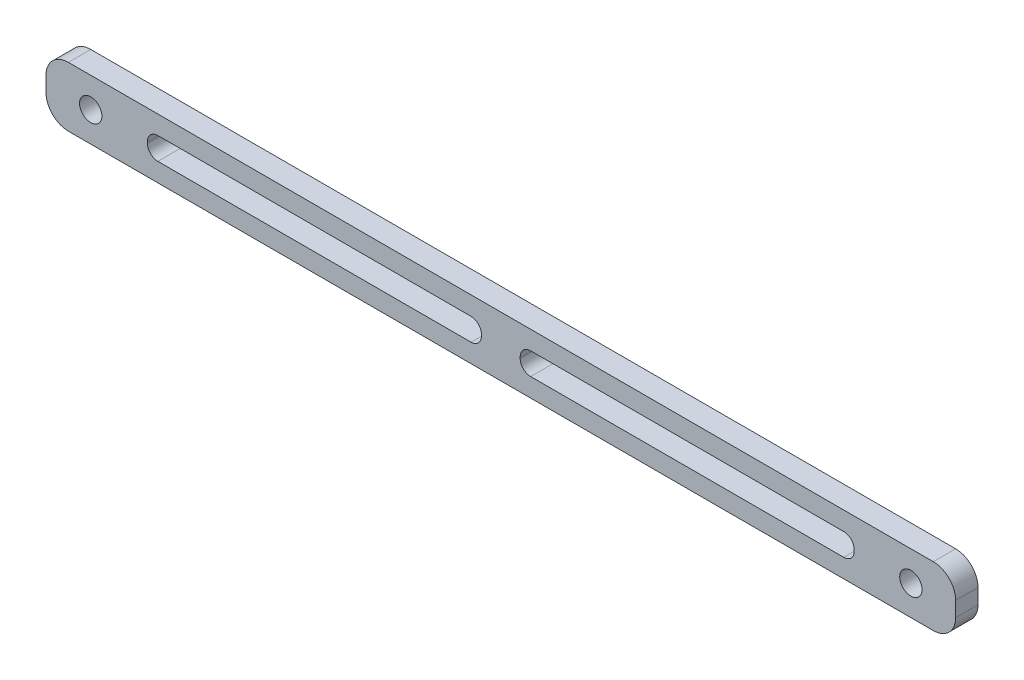
ISO-10303-21;
HEADER;
FILE_DESCRIPTION(('STEP AP214'),'2;1');
FILE_NAME('part.step','',(''),(''),'','','');
FILE_SCHEMA(('AUTOMOTIVE_DESIGN { 1 0 10303 214 1 1 1 1 }'));
ENDSEC;
DATA;
#1=APPLICATION_CONTEXT('core data for automotive mechanical design processes');
#2=APPLICATION_PROTOCOL_DEFINITION('international standard','automotive_design',2000,#1);
#3=PRODUCT_CONTEXT('',#1,'mechanical');
#4=PRODUCT('Part','Part','',(#3));
#5=PRODUCT_RELATED_PRODUCT_CATEGORY('part','',(#4));
#6=PRODUCT_DEFINITION_FORMATION('','',#4);
#7=PRODUCT_DEFINITION_CONTEXT('part definition',#1,'design');
#8=PRODUCT_DEFINITION('design','',#6,#7);
#9=PRODUCT_DEFINITION_SHAPE('','',#8);
#10=(LENGTH_UNIT() NAMED_UNIT(*) SI_UNIT(.MILLI.,.METRE.));
#11=(NAMED_UNIT(*) PLANE_ANGLE_UNIT() SI_UNIT($,.RADIAN.));
#12=(NAMED_UNIT(*) SI_UNIT($,.STERADIAN.) SOLID_ANGLE_UNIT());
#13=UNCERTAINTY_MEASURE_WITH_UNIT(LENGTH_MEASURE(1.E-05),#10,'distance_accuracy_value','');
#14=(GEOMETRIC_REPRESENTATION_CONTEXT(3) GLOBAL_UNCERTAINTY_ASSIGNED_CONTEXT((#13)) GLOBAL_UNIT_ASSIGNED_CONTEXT((#10,
#11,#12)) REPRESENTATION_CONTEXT('',''));
#15=CARTESIAN_POINT('',(0.,0.,0.));
#16=DIRECTION('',(0.,0.,1.));
#17=DIRECTION('',(1.,0.,0.));
#18=AXIS2_PLACEMENT_3D('',#15,#16,#17);
#19=CARTESIAN_POINT('',(58.,-0.999999999999999,3.));
#20=DIRECTION('',(0.,0.,1.));
#21=DIRECTION('',(1.,0.,0.));
#22=AXIS2_PLACEMENT_3D('',#19,#20,#21);
#23=PLANE('',#22);
#24=CARTESIAN_POINT('',(-55.,0.,3.));
#25=DIRECTION('',(0.,0.,1.));
#26=DIRECTION('',(1.,0.,0.));
#27=AXIS2_PLACEMENT_3D('',#24,#25,#26);
#28=CIRCLE('',#27,1.5);
#29=CARTESIAN_POINT('',(-53.5,0.,3.));
#30=VERTEX_POINT('',#29);
#31=EDGE_CURVE('E328',#30,#30,#28,.T.);
#32=ORIENTED_EDGE('',*,*,#31,.F.);
#33=EDGE_LOOP('',(#32));
#34=FACE_BOUND('',#33,.T.);
#35=CARTESIAN_POINT('',(58.,-0.999999999999999,3.));
#36=DIRECTION('',(0.,0.,1.));
#37=DIRECTION('',(1.,0.,0.));
#38=AXIS2_PLACEMENT_3D('',#35,#36,#37);
#39=CIRCLE('',#38,3.);
#40=CARTESIAN_POINT('',(58.,-4.,3.));
#41=VERTEX_POINT('',#40);
#42=CARTESIAN_POINT('',(61.,-0.999999999999977,3.));
#43=VERTEX_POINT('',#42);
#44=EDGE_CURVE('E334',#41,#43,#39,.T.);
#45=ORIENTED_EDGE('',*,*,#44,.T.);
#46=DIRECTION('',(0.,1.,0.));
#47=VECTOR('',#46,1.);
#48=CARTESIAN_POINT('',(61.,0.99999999999998,3.));
#49=LINE('',#48,#47);
#50=CARTESIAN_POINT('',(61.,0.999999999999981,3.));
#51=VERTEX_POINT('',#50);
#52=EDGE_CURVE('E337',#43,#51,#49,.T.);
#53=ORIENTED_EDGE('',*,*,#52,.T.);
#54=CARTESIAN_POINT('',(58.,1.,3.));
#55=DIRECTION('',(0.,0.,1.));
#56=DIRECTION('',(1.,0.,0.));
#57=AXIS2_PLACEMENT_3D('',#54,#55,#56);
#58=CIRCLE('',#57,3.);
#59=CARTESIAN_POINT('',(58.,4.,3.));
#60=VERTEX_POINT('',#59);
#61=EDGE_CURVE('E340',#51,#60,#58,.T.);
#62=ORIENTED_EDGE('',*,*,#61,.T.);
#63=DIRECTION('',(-1.,0.,0.));
#64=VECTOR('',#63,1.);
#65=CARTESIAN_POINT('',(-58.,4.,3.));
#66=LINE('',#65,#64);
#67=CARTESIAN_POINT('',(-58.,4.,3.));
#68=VERTEX_POINT('',#67);
#69=EDGE_CURVE('E342',#60,#68,#66,.T.);
#70=ORIENTED_EDGE('',*,*,#69,.T.);
#71=CARTESIAN_POINT('',(-58.,1.,3.));
#72=DIRECTION('',(0.,0.,1.));
#73=DIRECTION('',(1.,0.,0.));
#74=AXIS2_PLACEMENT_3D('',#71,#72,#73);
#75=CIRCLE('',#74,3.);
#76=CARTESIAN_POINT('',(-61.,0.99999999999998,3.));
#77=VERTEX_POINT('',#76);
#78=EDGE_CURVE('E344',#68,#77,#75,.T.);
#79=ORIENTED_EDGE('',*,*,#78,.T.);
#80=DIRECTION('',(0.,-1.,0.));
#81=VECTOR('',#80,1.);
#82=CARTESIAN_POINT('',(-61.,0.99999999999998,3.));
#83=LINE('',#82,#81);
#84=CARTESIAN_POINT('',(-61.,-0.999999999999999,3.));
#85=VERTEX_POINT('',#84);
#86=EDGE_CURVE('E346',#77,#85,#83,.T.);
#87=ORIENTED_EDGE('',*,*,#86,.T.);
#88=CARTESIAN_POINT('',(-58.,-0.999999999999999,3.));
#89=DIRECTION('',(0.,0.,1.));
#90=DIRECTION('',(-1.,0.,0.));
#91=AXIS2_PLACEMENT_3D('',#88,#89,#90);
#92=CIRCLE('',#91,3.);
#93=CARTESIAN_POINT('',(-58.,-4.,3.));
#94=VERTEX_POINT('',#93);
#95=EDGE_CURVE('E348',#85,#94,#92,.T.);
#96=ORIENTED_EDGE('',*,*,#95,.T.);
#97=DIRECTION('',(1.,0.,0.));
#98=VECTOR('',#97,1.);
#99=CARTESIAN_POINT('',(-58.,-4.,3.));
#100=LINE('',#99,#98);
#101=EDGE_CURVE('E350',#94,#41,#100,.T.);
#102=ORIENTED_EDGE('',*,*,#101,.T.);
#103=EDGE_LOOP('',(#45,#53,#62,#70,#79,#87,#96,#102));
#104=FACE_BOUND('',#103,.T.);
#105=CARTESIAN_POINT('',(55.,0.,3.));
#106=DIRECTION('',(0.,0.,1.));
#107=DIRECTION('',(1.,0.,0.));
#108=AXIS2_PLACEMENT_3D('',#105,#106,#107);
#109=CIRCLE('',#108,1.5);
#110=CARTESIAN_POINT('',(56.5,0.,3.));
#111=VERTEX_POINT('',#110);
#112=EDGE_CURVE('E322',#111,#111,#109,.T.);
#113=ORIENTED_EDGE('',*,*,#112,.F.);
#114=EDGE_LOOP('',(#113));
#115=FACE_BOUND('',#114,.T.);
#116=DIRECTION('',(0.,1.,0.));
#117=VECTOR('',#116,1.);
#118=CARTESIAN_POINT('',(-2.6,0.0999999999999972,3.));
#119=LINE('',#118,#117);
#120=CARTESIAN_POINT('',(-2.6,-0.100000000000003,3.));
#121=VERTEX_POINT('',#120);
#122=CARTESIAN_POINT('',(-2.6,0.0999999999999972,3.));
#123=VERTEX_POINT('',#122);
#124=EDGE_CURVE('E265',#121,#123,#119,.T.);
#125=ORIENTED_EDGE('',*,*,#124,.F.);
#126=CARTESIAN_POINT('',(-4.,-0.100000000000003,3.));
#127=DIRECTION('',(0.,0.,1.));
#128=DIRECTION('',(-1.,0.,0.));
#129=AXIS2_PLACEMENT_3D('',#126,#127,#128);
#130=CIRCLE('',#129,1.4);
#131=CARTESIAN_POINT('',(-4.,-1.5,3.));
#132=VERTEX_POINT('',#131);
#133=EDGE_CURVE('E263',#132,#121,#130,.T.);
#134=ORIENTED_EDGE('',*,*,#133,.F.);
#135=DIRECTION('',(1.,0.,0.));
#136=VECTOR('',#135,1.);
#137=CARTESIAN_POINT('',(-46.,-1.5,3.));
#138=LINE('',#137,#136);
#139=CARTESIAN_POINT('',(-46.,-1.5,3.));
#140=VERTEX_POINT('',#139);
#141=EDGE_CURVE('E279',#140,#132,#138,.T.);
#142=ORIENTED_EDGE('',*,*,#141,.F.);
#143=CARTESIAN_POINT('',(-46.,-0.100000000000003,3.));
#144=DIRECTION('',(0.,0.,1.));
#145=DIRECTION('',(-1.,0.,0.));
#146=AXIS2_PLACEMENT_3D('',#143,#144,#145);
#147=CIRCLE('',#146,1.4);
#148=CARTESIAN_POINT('',(-47.4,-0.100000000000003,3.));
#149=VERTEX_POINT('',#148);
#150=EDGE_CURVE('E276',#149,#140,#147,.T.);
#151=ORIENTED_EDGE('',*,*,#150,.F.);
#152=DIRECTION('',(0.,-1.,0.));
#153=VECTOR('',#152,1.);
#154=CARTESIAN_POINT('',(-47.4,0.099999999999997,3.));
#155=LINE('',#154,#153);
#156=CARTESIAN_POINT('',(-47.4,0.0999999999999972,3.));
#157=VERTEX_POINT('',#156);
#158=EDGE_CURVE('E274',#157,#149,#155,.T.);
#159=ORIENTED_EDGE('',*,*,#158,.F.);
#160=CARTESIAN_POINT('',(-46.,0.099999999999997,3.));
#161=DIRECTION('',(0.,0.,1.));
#162=DIRECTION('',(1.,0.,0.));
#163=AXIS2_PLACEMENT_3D('',#160,#161,#162);
#164=CIRCLE('',#163,1.39999999999999);
#165=CARTESIAN_POINT('',(-46.,1.5,3.));
#166=VERTEX_POINT('',#165);
#167=EDGE_CURVE('E272',#166,#157,#164,.T.);
#168=ORIENTED_EDGE('',*,*,#167,.F.);
#169=DIRECTION('',(-1.,0.,0.));
#170=VECTOR('',#169,1.);
#171=CARTESIAN_POINT('',(-46.,1.5,3.));
#172=LINE('',#171,#170);
#173=CARTESIAN_POINT('',(-4.,1.5,3.));
#174=VERTEX_POINT('',#173);
#175=EDGE_CURVE('E270',#174,#166,#172,.T.);
#176=ORIENTED_EDGE('',*,*,#175,.F.);
#177=CARTESIAN_POINT('',(-4.,0.099999999999997,3.));
#178=DIRECTION('',(0.,0.,1.));
#179=DIRECTION('',(1.,0.,0.));
#180=AXIS2_PLACEMENT_3D('',#177,#178,#179);
#181=CIRCLE('',#180,1.4);
#182=EDGE_CURVE('E268',#123,#174,#181,.T.);
#183=ORIENTED_EDGE('',*,*,#182,.F.);
#184=EDGE_LOOP('',(#125,#134,#142,#151,#159,#168,#176,#183));
#185=FACE_BOUND('',#184,.T.);
#186=DIRECTION('',(0.,1.,0.));
#187=VECTOR('',#186,1.);
#188=CARTESIAN_POINT('',(47.4,0.0943302489444198,3.));
#189=LINE('',#188,#187);
#190=CARTESIAN_POINT('',(47.4,-0.0943302489444121,3.));
#191=VERTEX_POINT('',#190);
#192=CARTESIAN_POINT('',(47.4,0.0943302489444198,3.));
#193=VERTEX_POINT('',#192);
#194=EDGE_CURVE('E206',#191,#193,#189,.T.);
#195=ORIENTED_EDGE('',*,*,#194,.F.);
#196=CARTESIAN_POINT('',(46.,-0.0943302489444123,3.));
#197=DIRECTION('',(0.,0.,1.));
#198=DIRECTION('',(-1.,0.,0.));
#199=AXIS2_PLACEMENT_3D('',#196,#197,#198);
#200=CIRCLE('',#199,1.4);
#201=CARTESIAN_POINT('',(46.,-1.49433024894441,3.));
#202=VERTEX_POINT('',#201);
#203=EDGE_CURVE('E198',#202,#191,#200,.T.);
#204=ORIENTED_EDGE('',*,*,#203,.F.);
#205=DIRECTION('',(1.,0.,0.));
#206=VECTOR('',#205,1.);
#207=CARTESIAN_POINT('',(4.00000000000001,-1.49433024894441,3.));
#208=LINE('',#207,#206);
#209=CARTESIAN_POINT('',(4.00000000000001,-1.49433024894441,3.));
#210=VERTEX_POINT('',#209);
#211=EDGE_CURVE('E231',#210,#202,#208,.T.);
#212=ORIENTED_EDGE('',*,*,#211,.F.);
#213=CARTESIAN_POINT('',(4.00000000000001,-0.0943302489444123,3.));
#214=DIRECTION('',(0.,0.,1.));
#215=DIRECTION('',(-1.,0.,0.));
#216=AXIS2_PLACEMENT_3D('',#213,#214,#215);
#217=CIRCLE('',#216,1.4);
#218=CARTESIAN_POINT('',(2.60000000000001,-0.0943302489444125,3.));
#219=VERTEX_POINT('',#218);
#220=EDGE_CURVE('E229',#219,#210,#217,.T.);
#221=ORIENTED_EDGE('',*,*,#220,.F.);
#222=DIRECTION('',(0.,-1.,0.));
#223=VECTOR('',#222,1.);
#224=CARTESIAN_POINT('',(2.60000000000001,0.0943302489444195,3.));
#225=LINE('',#224,#223);
#226=CARTESIAN_POINT('',(2.60000000000001,0.0943302489444198,3.));
#227=VERTEX_POINT('',#226);
#228=EDGE_CURVE('E227',#227,#219,#225,.T.);
#229=ORIENTED_EDGE('',*,*,#228,.F.);
#230=CARTESIAN_POINT('',(4.00000000000001,0.0943302489444197,3.));
#231=DIRECTION('',(0.,0.,1.));
#232=DIRECTION('',(1.,0.,0.));
#233=AXIS2_PLACEMENT_3D('',#230,#231,#232);
#234=CIRCLE('',#233,1.4);
#235=CARTESIAN_POINT('',(4.00000000000001,1.49433024894442,3.));
#236=VERTEX_POINT('',#235);
#237=EDGE_CURVE('E225',#236,#227,#234,.T.);
#238=ORIENTED_EDGE('',*,*,#237,.F.);
#239=DIRECTION('',(-1.,0.,0.));
#240=VECTOR('',#239,1.);
#241=CARTESIAN_POINT('',(4.00000000000001,1.49433024894442,3.));
#242=LINE('',#241,#240);
#243=CARTESIAN_POINT('',(46.,1.49433024894442,3.));
#244=VERTEX_POINT('',#243);
#245=EDGE_CURVE('E221',#244,#236,#242,.T.);
#246=ORIENTED_EDGE('',*,*,#245,.F.);
#247=CARTESIAN_POINT('',(46.,0.0943302489444197,3.));
#248=DIRECTION('',(0.,0.,1.));
#249=DIRECTION('',(1.,0.,0.));
#250=AXIS2_PLACEMENT_3D('',#247,#248,#249);
#251=CIRCLE('',#250,1.4);
#252=EDGE_CURVE('E219',#193,#244,#251,.T.);
#253=ORIENTED_EDGE('',*,*,#252,.F.);
#254=EDGE_LOOP('',(#195,#204,#212,#221,#229,#238,#246,#253));
#255=FACE_BOUND('',#254,.T.);
#256=ADVANCED_FACE('F37',(#34,#104,#115,#185,#255),#23,.T.);
#257=CARTESIAN_POINT('',(58.,-0.999999999999999,0.));
#258=DIRECTION('',(0.,0.,1.));
#259=DIRECTION('',(1.,0.,0.));
#260=AXIS2_PLACEMENT_3D('',#257,#258,#259);
#261=PLANE('',#260);
#262=CARTESIAN_POINT('',(-4.,-0.100000000000003,0.));
#263=DIRECTION('',(0.,0.,1.));
#264=DIRECTION('',(-1.,0.,0.));
#265=AXIS2_PLACEMENT_3D('',#262,#263,#264);
#266=CIRCLE('',#265,1.4);
#267=CARTESIAN_POINT('',(-4.,-1.5,0.));
#268=VERTEX_POINT('',#267);
#269=CARTESIAN_POINT('',(-2.6,-0.100000000000003,0.));
#270=VERTEX_POINT('',#269);
#271=EDGE_CURVE('E214',#268,#270,#266,.T.);
#272=ORIENTED_EDGE('',*,*,#271,.T.);
#273=DIRECTION('',(0.,1.,0.));
#274=VECTOR('',#273,1.);
#275=CARTESIAN_POINT('',(-2.6,0.0999999999999972,0.));
#276=LINE('',#275,#274);
#277=CARTESIAN_POINT('',(-2.6,0.0999999999999972,0.));
#278=VERTEX_POINT('',#277);
#279=EDGE_CURVE('E284',#270,#278,#276,.T.);
#280=ORIENTED_EDGE('',*,*,#279,.T.);
#281=CARTESIAN_POINT('',(-4.,0.099999999999997,0.));
#282=DIRECTION('',(0.,0.,1.));
#283=DIRECTION('',(1.,0.,0.));
#284=AXIS2_PLACEMENT_3D('',#281,#282,#283);
#285=CIRCLE('',#284,1.4);
#286=CARTESIAN_POINT('',(-4.,1.5,0.));
#287=VERTEX_POINT('',#286);
#288=EDGE_CURVE('E287',#278,#287,#285,.T.);
#289=ORIENTED_EDGE('',*,*,#288,.T.);
#290=DIRECTION('',(-1.,0.,0.));
#291=VECTOR('',#290,1.);
#292=CARTESIAN_POINT('',(-46.,1.5,0.));
#293=LINE('',#292,#291);
#294=CARTESIAN_POINT('',(-46.,1.5,0.));
#295=VERTEX_POINT('',#294);
#296=EDGE_CURVE('E290',#287,#295,#293,.T.);
#297=ORIENTED_EDGE('',*,*,#296,.T.);
#298=CARTESIAN_POINT('',(-46.,0.099999999999997,0.));
#299=DIRECTION('',(0.,0.,1.));
#300=DIRECTION('',(1.,0.,0.));
#301=AXIS2_PLACEMENT_3D('',#298,#299,#300);
#302=CIRCLE('',#301,1.39999999999999);
#303=CARTESIAN_POINT('',(-47.4,0.0999999999999972,0.));
#304=VERTEX_POINT('',#303);
#305=EDGE_CURVE('E293',#295,#304,#302,.T.);
#306=ORIENTED_EDGE('',*,*,#305,.T.);
#307=DIRECTION('',(0.,-1.,0.));
#308=VECTOR('',#307,1.);
#309=CARTESIAN_POINT('',(-47.4,0.099999999999997,0.));
#310=LINE('',#309,#308);
#311=CARTESIAN_POINT('',(-47.4,-0.100000000000003,0.));
#312=VERTEX_POINT('',#311);
#313=EDGE_CURVE('E296',#304,#312,#310,.T.);
#314=ORIENTED_EDGE('',*,*,#313,.T.);
#315=CARTESIAN_POINT('',(-46.,-0.100000000000003,0.));
#316=DIRECTION('',(0.,0.,1.));
#317=DIRECTION('',(-1.,0.,0.));
#318=AXIS2_PLACEMENT_3D('',#315,#316,#317);
#319=CIRCLE('',#318,1.4);
#320=CARTESIAN_POINT('',(-46.,-1.5,0.));
#321=VERTEX_POINT('',#320);
#322=EDGE_CURVE('E299',#312,#321,#319,.T.);
#323=ORIENTED_EDGE('',*,*,#322,.T.);
#324=DIRECTION('',(1.,0.,0.));
#325=VECTOR('',#324,1.);
#326=CARTESIAN_POINT('',(-46.,-1.5,0.));
#327=LINE('',#326,#325);
#328=EDGE_CURVE('E266',#321,#268,#327,.T.);
#329=ORIENTED_EDGE('',*,*,#328,.T.);
#330=EDGE_LOOP('',(#272,#280,#289,#297,#306,#314,#323,#329));
#331=FACE_BOUND('',#330,.T.);
#332=CARTESIAN_POINT('',(58.,-0.999999999999999,0.));
#333=DIRECTION('',(0.,0.,1.));
#334=DIRECTION('',(1.,0.,0.));
#335=AXIS2_PLACEMENT_3D('',#332,#333,#334);
#336=CIRCLE('',#335,3.);
#337=CARTESIAN_POINT('',(58.,-4.,0.));
#338=VERTEX_POINT('',#337);
#339=CARTESIAN_POINT('',(61.,-0.999999999999977,0.));
#340=VERTEX_POINT('',#339);
#341=EDGE_CURVE('E331',#338,#340,#336,.T.);
#342=ORIENTED_EDGE('',*,*,#341,.F.);
#343=DIRECTION('',(1.,0.,0.));
#344=VECTOR('',#343,1.);
#345=CARTESIAN_POINT('',(-58.,-4.,0.));
#346=LINE('',#345,#344);
#347=CARTESIAN_POINT('',(-58.,-4.,0.));
#348=VERTEX_POINT('',#347);
#349=EDGE_CURVE('E338',#348,#338,#346,.T.);
#350=ORIENTED_EDGE('',*,*,#349,.F.);
#351=CARTESIAN_POINT('',(-58.,-0.999999999999999,0.));
#352=DIRECTION('',(0.,0.,1.));
#353=DIRECTION('',(-1.,0.,0.));
#354=AXIS2_PLACEMENT_3D('',#351,#352,#353);
#355=CIRCLE('',#354,3.);
#356=CARTESIAN_POINT('',(-61.,-0.999999999999999,0.));
#357=VERTEX_POINT('',#356);
#358=EDGE_CURVE('E365',#357,#348,#355,.T.);
#359=ORIENTED_EDGE('',*,*,#358,.F.);
#360=DIRECTION('',(0.,-1.,0.));
#361=VECTOR('',#360,1.);
#362=CARTESIAN_POINT('',(-61.,0.99999999999998,0.));
#363=LINE('',#362,#361);
#364=CARTESIAN_POINT('',(-61.,0.99999999999998,0.));
#365=VERTEX_POINT('',#364);
#366=EDGE_CURVE('E363',#365,#357,#363,.T.);
#367=ORIENTED_EDGE('',*,*,#366,.F.);
#368=CARTESIAN_POINT('',(-58.,1.,0.));
#369=DIRECTION('',(0.,0.,1.));
#370=DIRECTION('',(1.,0.,0.));
#371=AXIS2_PLACEMENT_3D('',#368,#369,#370);
#372=CIRCLE('',#371,3.);
#373=CARTESIAN_POINT('',(-58.,4.,0.));
#374=VERTEX_POINT('',#373);
#375=EDGE_CURVE('E361',#374,#365,#372,.T.);
#376=ORIENTED_EDGE('',*,*,#375,.F.);
#377=DIRECTION('',(-1.,0.,0.));
#378=VECTOR('',#377,1.);
#379=CARTESIAN_POINT('',(-58.,4.,0.));
#380=LINE('',#379,#378);
#381=CARTESIAN_POINT('',(58.,4.,0.));
#382=VERTEX_POINT('',#381);
#383=EDGE_CURVE('E359',#382,#374,#380,.T.);
#384=ORIENTED_EDGE('',*,*,#383,.F.);
#385=CARTESIAN_POINT('',(58.,1.,0.));
#386=DIRECTION('',(0.,0.,1.));
#387=DIRECTION('',(1.,0.,0.));
#388=AXIS2_PLACEMENT_3D('',#385,#386,#387);
#389=CIRCLE('',#388,3.);
#390=CARTESIAN_POINT('',(61.,0.999999999999981,0.));
#391=VERTEX_POINT('',#390);
#392=EDGE_CURVE('E357',#391,#382,#389,.T.);
#393=ORIENTED_EDGE('',*,*,#392,.F.);
#394=DIRECTION('',(0.,1.,0.));
#395=VECTOR('',#394,1.);
#396=CARTESIAN_POINT('',(61.,0.99999999999998,0.));
#397=LINE('',#396,#395);
#398=EDGE_CURVE('E355',#340,#391,#397,.T.);
#399=ORIENTED_EDGE('',*,*,#398,.F.);
#400=EDGE_LOOP('',(#342,#350,#359,#367,#376,#384,#393,#399));
#401=FACE_BOUND('',#400,.T.);
#402=CARTESIAN_POINT('',(-55.,0.,0.));
#403=DIRECTION('',(0.,0.,1.));
#404=DIRECTION('',(1.,0.,0.));
#405=AXIS2_PLACEMENT_3D('',#402,#403,#404);
#406=CIRCLE('',#405,1.5);
#407=CARTESIAN_POINT('',(-53.5,0.,0.));
#408=VERTEX_POINT('',#407);
#409=EDGE_CURVE('E325',#408,#408,#406,.T.);
#410=ORIENTED_EDGE('',*,*,#409,.T.);
#411=EDGE_LOOP('',(#410));
#412=FACE_BOUND('',#411,.T.);
#413=CARTESIAN_POINT('',(55.,0.,0.));
#414=DIRECTION('',(0.,0.,1.));
#415=DIRECTION('',(1.,0.,0.));
#416=AXIS2_PLACEMENT_3D('',#413,#414,#415);
#417=CIRCLE('',#416,1.5);
#418=CARTESIAN_POINT('',(56.5,0.,0.));
#419=VERTEX_POINT('',#418);
#420=EDGE_CURVE('E321',#419,#419,#417,.T.);
#421=ORIENTED_EDGE('',*,*,#420,.T.);
#422=EDGE_LOOP('',(#421));
#423=FACE_BOUND('',#422,.T.);
#424=CARTESIAN_POINT('',(46.,-0.0943302489444123,0.));
#425=DIRECTION('',(0.,0.,1.));
#426=DIRECTION('',(-1.,0.,0.));
#427=AXIS2_PLACEMENT_3D('',#424,#425,#426);
#428=CIRCLE('',#427,1.4);
#429=CARTESIAN_POINT('',(46.,-1.49433024894441,0.));
#430=VERTEX_POINT('',#429);
#431=CARTESIAN_POINT('',(47.4,-0.0943302489444121,0.));
#432=VERTEX_POINT('',#431);
#433=EDGE_CURVE('E60',#430,#432,#428,.T.);
#434=ORIENTED_EDGE('',*,*,#433,.T.);
#435=DIRECTION('',(0.,1.,0.));
#436=VECTOR('',#435,1.);
#437=CARTESIAN_POINT('',(47.4,0.0943302489444198,0.));
#438=LINE('',#437,#436);
#439=CARTESIAN_POINT('',(47.4,0.0943302489444198,0.));
#440=VERTEX_POINT('',#439);
#441=EDGE_CURVE('E213',#432,#440,#438,.T.);
#442=ORIENTED_EDGE('',*,*,#441,.T.);
#443=CARTESIAN_POINT('',(46.,0.0943302489444197,0.));
#444=DIRECTION('',(0.,0.,1.));
#445=DIRECTION('',(1.,0.,0.));
#446=AXIS2_PLACEMENT_3D('',#443,#444,#445);
#447=CIRCLE('',#446,1.4);
#448=CARTESIAN_POINT('',(46.,1.49433024894442,0.));
#449=VERTEX_POINT('',#448);
#450=EDGE_CURVE('E235',#440,#449,#447,.T.);
#451=ORIENTED_EDGE('',*,*,#450,.T.);
#452=DIRECTION('',(-1.,0.,0.));
#453=VECTOR('',#452,1.);
#454=CARTESIAN_POINT('',(4.00000000000001,1.49433024894442,0.));
#455=LINE('',#454,#453);
#456=CARTESIAN_POINT('',(4.00000000000001,1.49433024894442,0.));
#457=VERTEX_POINT('',#456);
#458=EDGE_CURVE('E238',#449,#457,#455,.T.);
#459=ORIENTED_EDGE('',*,*,#458,.T.);
#460=CARTESIAN_POINT('',(4.00000000000001,0.0943302489444197,0.));
#461=DIRECTION('',(0.,0.,1.));
#462=DIRECTION('',(1.,0.,0.));
#463=AXIS2_PLACEMENT_3D('',#460,#461,#462);
#464=CIRCLE('',#463,1.4);
#465=CARTESIAN_POINT('',(2.60000000000001,0.0943302489444198,0.));
#466=VERTEX_POINT('',#465);
#467=EDGE_CURVE('E241',#457,#466,#464,.T.);
#468=ORIENTED_EDGE('',*,*,#467,.T.);
#469=DIRECTION('',(0.,-1.,0.));
#470=VECTOR('',#469,1.);
#471=CARTESIAN_POINT('',(2.60000000000001,0.0943302489444195,0.));
#472=LINE('',#471,#470);
#473=CARTESIAN_POINT('',(2.60000000000001,-0.0943302489444125,0.));
#474=VERTEX_POINT('',#473);
#475=EDGE_CURVE('E244',#466,#474,#472,.T.);
#476=ORIENTED_EDGE('',*,*,#475,.T.);
#477=CARTESIAN_POINT('',(4.00000000000001,-0.0943302489444123,0.));
#478=DIRECTION('',(0.,0.,1.));
#479=DIRECTION('',(-1.,0.,0.));
#480=AXIS2_PLACEMENT_3D('',#477,#478,#479);
#481=CIRCLE('',#480,1.4);
#482=CARTESIAN_POINT('',(4.00000000000001,-1.49433024894441,0.));
#483=VERTEX_POINT('',#482);
#484=EDGE_CURVE('E247',#474,#483,#481,.T.);
#485=ORIENTED_EDGE('',*,*,#484,.T.);
#486=DIRECTION('',(1.,0.,0.));
#487=VECTOR('',#486,1.);
#488=CARTESIAN_POINT('',(4.00000000000001,-1.49433024894441,0.));
#489=LINE('',#488,#487);
#490=EDGE_CURVE('E207',#483,#430,#489,.T.);
#491=ORIENTED_EDGE('',*,*,#490,.T.);
#492=EDGE_LOOP('',(#434,#442,#451,#459,#468,#476,#485,#491));
#493=FACE_BOUND('',#492,.T.);
#494=ADVANCED_FACE('F395',(#331,#401,#412,#423,#493),#261,.F.);
#495=CARTESIAN_POINT('',(58.,-0.999999999999999,3.));
#496=DIRECTION('',(0.,0.,-1.));
#497=DIRECTION('',(-1.,0.,0.));
#498=AXIS2_PLACEMENT_3D('',#495,#496,#497);
#499=CYLINDRICAL_SURFACE('',#498,3.);
#500=ORIENTED_EDGE('',*,*,#341,.T.);
#501=DIRECTION('',(0.,0.,-1.));
#502=VECTOR('',#501,1.);
#503=CARTESIAN_POINT('',(61.,-0.999999999999977,3.));
#504=LINE('',#503,#502);
#505=EDGE_CURVE('E11',#43,#340,#504,.T.);
#506=ORIENTED_EDGE('',*,*,#505,.F.);
#507=ORIENTED_EDGE('',*,*,#44,.F.);
#508=DIRECTION('',(0.,0.,-1.));
#509=VECTOR('',#508,1.);
#510=CARTESIAN_POINT('',(58.,-4.,3.));
#511=LINE('',#510,#509);
#512=EDGE_CURVE('E352',#41,#338,#511,.T.);
#513=ORIENTED_EDGE('',*,*,#512,.T.);
#514=EDGE_LOOP('',(#500,#506,#507,#513));
#515=FACE_BOUND('',#514,.T.);
#516=ADVANCED_FACE('F39',(#515),#499,.T.);
#517=CARTESIAN_POINT('',(61.,0.99999999999998,3.));
#518=DIRECTION('',(-1.,0.,0.));
#519=DIRECTION('',(0.,0.,1.));
#520=AXIS2_PLACEMENT_3D('',#517,#518,#519);
#521=PLANE('',#520);
#522=ORIENTED_EDGE('',*,*,#398,.T.);
#523=DIRECTION('',(0.,0.,-1.));
#524=VECTOR('',#523,1.);
#525=CARTESIAN_POINT('',(61.,0.999999999999981,3.));
#526=LINE('',#525,#524);
#527=EDGE_CURVE('E45',#51,#391,#526,.T.);
#528=ORIENTED_EDGE('',*,*,#527,.F.);
#529=ORIENTED_EDGE('',*,*,#52,.F.);
#530=ORIENTED_EDGE('',*,*,#505,.T.);
#531=EDGE_LOOP('',(#522,#528,#529,#530));
#532=FACE_BOUND('',#531,.T.);
#533=ADVANCED_FACE('F413',(#532),#521,.F.);
#534=CARTESIAN_POINT('',(58.,1.,3.));
#535=DIRECTION('',(0.,0.,-1.));
#536=DIRECTION('',(-1.,0.,0.));
#537=AXIS2_PLACEMENT_3D('',#534,#535,#536);
#538=CYLINDRICAL_SURFACE('',#537,3.);
#539=ORIENTED_EDGE('',*,*,#392,.T.);
#540=DIRECTION('',(0.,0.,-1.));
#541=VECTOR('',#540,1.);
#542=CARTESIAN_POINT('',(58.,4.,3.));
#543=LINE('',#542,#541);
#544=EDGE_CURVE('E382',#60,#382,#543,.T.);
#545=ORIENTED_EDGE('',*,*,#544,.F.);
#546=ORIENTED_EDGE('',*,*,#61,.F.);
#547=ORIENTED_EDGE('',*,*,#527,.T.);
#548=EDGE_LOOP('',(#539,#545,#546,#547));
#549=FACE_BOUND('',#548,.T.);
#550=ADVANCED_FACE('F389',(#549),#538,.T.);
#551=CARTESIAN_POINT('',(-58.,4.,3.));
#552=DIRECTION('',(0.,-1.,0.));
#553=DIRECTION('',(0.,0.,-1.));
#554=AXIS2_PLACEMENT_3D('',#551,#552,#553);
#555=PLANE('',#554);
#556=ORIENTED_EDGE('',*,*,#383,.T.);
#557=DIRECTION('',(0.,0.,-1.));
#558=VECTOR('',#557,1.);
#559=CARTESIAN_POINT('',(-58.,4.,3.));
#560=LINE('',#559,#558);
#561=EDGE_CURVE('E379',#68,#374,#560,.T.);
#562=ORIENTED_EDGE('',*,*,#561,.F.);
#563=ORIENTED_EDGE('',*,*,#69,.F.);
#564=ORIENTED_EDGE('',*,*,#544,.T.);
#565=EDGE_LOOP('',(#556,#562,#563,#564));
#566=FACE_BOUND('',#565,.T.);
#567=ADVANCED_FACE('F401',(#566),#555,.F.);
#568=CARTESIAN_POINT('',(-58.,1.,3.));
#569=DIRECTION('',(0.,0.,-1.));
#570=DIRECTION('',(-1.,0.,0.));
#571=AXIS2_PLACEMENT_3D('',#568,#569,#570);
#572=CYLINDRICAL_SURFACE('',#571,3.);
#573=ORIENTED_EDGE('',*,*,#375,.T.);
#574=DIRECTION('',(0.,0.,-1.));
#575=VECTOR('',#574,1.);
#576=CARTESIAN_POINT('',(-61.,0.99999999999998,3.));
#577=LINE('',#576,#575);
#578=EDGE_CURVE('E376',#77,#365,#577,.T.);
#579=ORIENTED_EDGE('',*,*,#578,.F.);
#580=ORIENTED_EDGE('',*,*,#78,.F.);
#581=ORIENTED_EDGE('',*,*,#561,.T.);
#582=EDGE_LOOP('',(#573,#579,#580,#581));
#583=FACE_BOUND('',#582,.T.);
#584=ADVANCED_FACE('F405',(#583),#572,.T.);
#585=CARTESIAN_POINT('',(-61.,0.99999999999998,3.));
#586=DIRECTION('',(1.,0.,0.));
#587=DIRECTION('',(0.,0.,-1.));
#588=AXIS2_PLACEMENT_3D('',#585,#586,#587);
#589=PLANE('',#588);
#590=ORIENTED_EDGE('',*,*,#366,.T.);
#591=DIRECTION('',(0.,0.,-1.));
#592=VECTOR('',#591,1.);
#593=CARTESIAN_POINT('',(-61.,-0.999999999999999,3.));
#594=LINE('',#593,#592);
#595=EDGE_CURVE('E373',#85,#357,#594,.T.);
#596=ORIENTED_EDGE('',*,*,#595,.F.);
#597=ORIENTED_EDGE('',*,*,#86,.F.);
#598=ORIENTED_EDGE('',*,*,#578,.T.);
#599=EDGE_LOOP('',(#590,#596,#597,#598));
#600=FACE_BOUND('',#599,.T.);
#601=ADVANCED_FACE('F426',(#600),#589,.F.);
#602=CARTESIAN_POINT('',(-58.,-0.999999999999999,3.));
#603=DIRECTION('',(0.,0.,-1.));
#604=DIRECTION('',(-1.,0.,0.));
#605=AXIS2_PLACEMENT_3D('',#602,#603,#604);
#606=CYLINDRICAL_SURFACE('',#605,3.);
#607=ORIENTED_EDGE('',*,*,#358,.T.);
#608=DIRECTION('',(0.,0.,-1.));
#609=VECTOR('',#608,1.);
#610=CARTESIAN_POINT('',(-58.,-4.,3.));
#611=LINE('',#610,#609);
#612=EDGE_CURVE('E370',#94,#348,#611,.T.);
#613=ORIENTED_EDGE('',*,*,#612,.F.);
#614=ORIENTED_EDGE('',*,*,#95,.F.);
#615=ORIENTED_EDGE('',*,*,#595,.T.);
#616=EDGE_LOOP('',(#607,#613,#614,#615));
#617=FACE_BOUND('',#616,.T.);
#618=ADVANCED_FACE('F424',(#617),#606,.T.);
#619=CARTESIAN_POINT('',(-58.,-4.,3.));
#620=DIRECTION('',(0.,1.,0.));
#621=DIRECTION('',(0.,0.,1.));
#622=AXIS2_PLACEMENT_3D('',#619,#620,#621);
#623=PLANE('',#622);
#624=ORIENTED_EDGE('',*,*,#349,.T.);
#625=ORIENTED_EDGE('',*,*,#512,.F.);
#626=ORIENTED_EDGE('',*,*,#101,.F.);
#627=ORIENTED_EDGE('',*,*,#612,.T.);
#628=EDGE_LOOP('',(#624,#625,#626,#627));
#629=FACE_BOUND('',#628,.T.);
#630=ADVANCED_FACE('F419',(#629),#623,.F.);
#631=CARTESIAN_POINT('',(-55.,0.,3.));
#632=DIRECTION('',(0.,0.,-1.));
#633=DIRECTION('',(-1.,0.,0.));
#634=AXIS2_PLACEMENT_3D('',#631,#632,#633);
#635=CYLINDRICAL_SURFACE('',#634,1.5);
#636=ORIENTED_EDGE('',*,*,#31,.T.);
#637=EDGE_LOOP('',(#636));
#638=FACE_BOUND('',#637,.T.);
#639=ORIENTED_EDGE('',*,*,#409,.F.);
#640=EDGE_LOOP('',(#639));
#641=FACE_BOUND('',#640,.T.);
#642=ADVANCED_FACE('F445',(#638,#641),#635,.F.);
#643=CARTESIAN_POINT('',(55.,0.,3.));
#644=DIRECTION('',(0.,0.,-1.));
#645=DIRECTION('',(-1.,0.,0.));
#646=AXIS2_PLACEMENT_3D('',#643,#644,#645);
#647=CYLINDRICAL_SURFACE('',#646,1.5);
#648=ORIENTED_EDGE('',*,*,#112,.T.);
#649=EDGE_LOOP('',(#648));
#650=FACE_BOUND('',#649,.T.);
#651=ORIENTED_EDGE('',*,*,#420,.F.);
#652=EDGE_LOOP('',(#651));
#653=FACE_BOUND('',#652,.T.);
#654=ADVANCED_FACE('F452',(#650,#653),#647,.F.);
#655=CARTESIAN_POINT('',(-4.,-0.100000000000003,3.));
#656=DIRECTION('',(0.,0.,-1.));
#657=DIRECTION('',(-1.,0.,0.));
#658=AXIS2_PLACEMENT_3D('',#655,#656,#657);
#659=CYLINDRICAL_SURFACE('',#658,1.4);
#660=ORIENTED_EDGE('',*,*,#271,.F.);
#661=DIRECTION('',(0.,0.,-1.));
#662=VECTOR('',#661,1.);
#663=CARTESIAN_POINT('',(-4.,-1.5,3.));
#664=LINE('',#663,#662);
#665=EDGE_CURVE('E281',#132,#268,#664,.T.);
#666=ORIENTED_EDGE('',*,*,#665,.F.);
#667=ORIENTED_EDGE('',*,*,#133,.T.);
#668=DIRECTION('',(0.,0.,-1.));
#669=VECTOR('',#668,1.);
#670=CARTESIAN_POINT('',(-2.6,-0.100000000000003,3.));
#671=LINE('',#670,#669);
#672=EDGE_CURVE('E318',#121,#270,#671,.T.);
#673=ORIENTED_EDGE('',*,*,#672,.T.);
#674=EDGE_LOOP('',(#660,#666,#667,#673));
#675=FACE_BOUND('',#674,.T.);
#676=ADVANCED_FACE('F457',(#675),#659,.F.);
#677=CARTESIAN_POINT('',(-2.6,0.0999999999999972,3.));
#678=DIRECTION('',(-1.,0.,0.));
#679=DIRECTION('',(0.,-1.,0.));
#680=AXIS2_PLACEMENT_3D('',#677,#678,#679);
#681=PLANE('',#680);
#682=ORIENTED_EDGE('',*,*,#279,.F.);
#683=ORIENTED_EDGE('',*,*,#672,.F.);
#684=ORIENTED_EDGE('',*,*,#124,.T.);
#685=DIRECTION('',(0.,0.,-1.));
#686=VECTOR('',#685,1.);
#687=CARTESIAN_POINT('',(-2.6,0.0999999999999972,3.));
#688=LINE('',#687,#686);
#689=EDGE_CURVE('E316',#123,#278,#688,.T.);
#690=ORIENTED_EDGE('',*,*,#689,.T.);
#691=EDGE_LOOP('',(#682,#683,#684,#690));
#692=FACE_BOUND('',#691,.T.);
#693=ADVANCED_FACE('F522',(#692),#681,.T.);
#694=CARTESIAN_POINT('',(-4.,0.099999999999997,3.));
#695=DIRECTION('',(0.,0.,-1.));
#696=DIRECTION('',(-1.,0.,0.));
#697=AXIS2_PLACEMENT_3D('',#694,#695,#696);
#698=CYLINDRICAL_SURFACE('',#697,1.4);
#699=ORIENTED_EDGE('',*,*,#288,.F.);
#700=ORIENTED_EDGE('',*,*,#689,.F.);
#701=ORIENTED_EDGE('',*,*,#182,.T.);
#702=DIRECTION('',(0.,0.,-1.));
#703=VECTOR('',#702,1.);
#704=CARTESIAN_POINT('',(-4.,1.5,3.));
#705=LINE('',#704,#703);
#706=EDGE_CURVE('E314',#174,#287,#705,.T.);
#707=ORIENTED_EDGE('',*,*,#706,.T.);
#708=EDGE_LOOP('',(#699,#700,#701,#707));
#709=FACE_BOUND('',#708,.T.);
#710=ADVANCED_FACE('F518',(#709),#698,.F.);
#711=CARTESIAN_POINT('',(-46.,1.5,3.));
#712=DIRECTION('',(0.,-1.,0.));
#713=DIRECTION('',(1.,0.,0.));
#714=AXIS2_PLACEMENT_3D('',#711,#712,#713);
#715=PLANE('',#714);
#716=ORIENTED_EDGE('',*,*,#296,.F.);
#717=ORIENTED_EDGE('',*,*,#706,.F.);
#718=ORIENTED_EDGE('',*,*,#175,.T.);
#719=DIRECTION('',(0.,0.,-1.));
#720=VECTOR('',#719,1.);
#721=CARTESIAN_POINT('',(-46.,1.5,3.));
#722=LINE('',#721,#720);
#723=EDGE_CURVE('E312',#166,#295,#722,.T.);
#724=ORIENTED_EDGE('',*,*,#723,.T.);
#725=EDGE_LOOP('',(#716,#717,#718,#724));
#726=FACE_BOUND('',#725,.T.);
#727=ADVANCED_FACE('F514',(#726),#715,.T.);
#728=CARTESIAN_POINT('',(-46.,0.099999999999997,3.));
#729=DIRECTION('',(0.,0.,-1.));
#730=DIRECTION('',(-1.,0.,0.));
#731=AXIS2_PLACEMENT_3D('',#728,#729,#730);
#732=CYLINDRICAL_SURFACE('',#731,1.39999999999999);
#733=ORIENTED_EDGE('',*,*,#305,.F.);
#734=ORIENTED_EDGE('',*,*,#723,.F.);
#735=ORIENTED_EDGE('',*,*,#167,.T.);
#736=DIRECTION('',(0.,0.,-1.));
#737=VECTOR('',#736,1.);
#738=CARTESIAN_POINT('',(-47.4,0.0999999999999972,3.));
#739=LINE('',#738,#737);
#740=EDGE_CURVE('E310',#157,#304,#739,.T.);
#741=ORIENTED_EDGE('',*,*,#740,.T.);
#742=EDGE_LOOP('',(#733,#734,#735,#741));
#743=FACE_BOUND('',#742,.T.);
#744=ADVANCED_FACE('F510',(#743),#732,.F.);
#745=CARTESIAN_POINT('',(-47.4,0.099999999999997,3.));
#746=DIRECTION('',(1.,0.,0.));
#747=DIRECTION('',(0.,1.,0.));
#748=AXIS2_PLACEMENT_3D('',#745,#746,#747);
#749=PLANE('',#748);
#750=ORIENTED_EDGE('',*,*,#313,.F.);
#751=ORIENTED_EDGE('',*,*,#740,.F.);
#752=ORIENTED_EDGE('',*,*,#158,.T.);
#753=DIRECTION('',(0.,0.,-1.));
#754=VECTOR('',#753,1.);
#755=CARTESIAN_POINT('',(-47.4,-0.100000000000003,3.));
#756=LINE('',#755,#754);
#757=EDGE_CURVE('E308',#149,#312,#756,.T.);
#758=ORIENTED_EDGE('',*,*,#757,.T.);
#759=EDGE_LOOP('',(#750,#751,#752,#758));
#760=FACE_BOUND('',#759,.T.);
#761=ADVANCED_FACE('F506',(#760),#749,.T.);
#762=CARTESIAN_POINT('',(-46.,-0.100000000000003,3.));
#763=DIRECTION('',(0.,0.,-1.));
#764=DIRECTION('',(-1.,0.,0.));
#765=AXIS2_PLACEMENT_3D('',#762,#763,#764);
#766=CYLINDRICAL_SURFACE('',#765,1.4);
#767=ORIENTED_EDGE('',*,*,#322,.F.);
#768=ORIENTED_EDGE('',*,*,#757,.F.);
#769=ORIENTED_EDGE('',*,*,#150,.T.);
#770=DIRECTION('',(0.,0.,-1.));
#771=VECTOR('',#770,1.);
#772=CARTESIAN_POINT('',(-46.,-1.5,3.));
#773=LINE('',#772,#771);
#774=EDGE_CURVE('E306',#140,#321,#773,.T.);
#775=ORIENTED_EDGE('',*,*,#774,.T.);
#776=EDGE_LOOP('',(#767,#768,#769,#775));
#777=FACE_BOUND('',#776,.T.);
#778=ADVANCED_FACE('F502',(#777),#766,.F.);
#779=CARTESIAN_POINT('',(-46.,-1.5,3.));
#780=DIRECTION('',(0.,1.,0.));
#781=DIRECTION('',(0.,0.,1.));
#782=AXIS2_PLACEMENT_3D('',#779,#780,#781);
#783=PLANE('',#782);
#784=ORIENTED_EDGE('',*,*,#328,.F.);
#785=ORIENTED_EDGE('',*,*,#774,.F.);
#786=ORIENTED_EDGE('',*,*,#141,.T.);
#787=ORIENTED_EDGE('',*,*,#665,.T.);
#788=EDGE_LOOP('',(#784,#785,#786,#787));
#789=FACE_BOUND('',#788,.T.);
#790=ADVANCED_FACE('F499',(#789),#783,.T.);
#791=CARTESIAN_POINT('',(46.,-0.0943302489444123,3.));
#792=DIRECTION('',(0.,0.,-1.));
#793=DIRECTION('',(-1.,0.,0.));
#794=AXIS2_PLACEMENT_3D('',#791,#792,#793);
#795=CYLINDRICAL_SURFACE('',#794,1.4);
#796=ORIENTED_EDGE('',*,*,#433,.F.);
#797=DIRECTION('',(0.,0.,-1.));
#798=VECTOR('',#797,1.);
#799=CARTESIAN_POINT('',(46.,-1.49433024894441,3.));
#800=LINE('',#799,#798);
#801=EDGE_CURVE('E202',#202,#430,#800,.T.);
#802=ORIENTED_EDGE('',*,*,#801,.F.);
#803=ORIENTED_EDGE('',*,*,#203,.T.);
#804=DIRECTION('',(0.,0.,-1.));
#805=VECTOR('',#804,1.);
#806=CARTESIAN_POINT('',(47.4,-0.0943302489444121,3.));
#807=LINE('',#806,#805);
#808=EDGE_CURVE('E201',#191,#432,#807,.T.);
#809=ORIENTED_EDGE('',*,*,#808,.T.);
#810=EDGE_LOOP('',(#796,#802,#803,#809));
#811=FACE_BOUND('',#810,.T.);
#812=ADVANCED_FACE('F200',(#811),#795,.F.);
#813=CARTESIAN_POINT('',(47.4,0.0943302489444198,3.));
#814=DIRECTION('',(-1.,0.,0.));
#815=DIRECTION('',(0.,0.,1.));
#816=AXIS2_PLACEMENT_3D('',#813,#814,#815);
#817=PLANE('',#816);
#818=ORIENTED_EDGE('',*,*,#441,.F.);
#819=ORIENTED_EDGE('',*,*,#808,.F.);
#820=ORIENTED_EDGE('',*,*,#194,.T.);
#821=DIRECTION('',(0.,0.,-1.));
#822=VECTOR('',#821,1.);
#823=CARTESIAN_POINT('',(47.4,0.0943302489444198,3.));
#824=LINE('',#823,#822);
#825=EDGE_CURVE('E215',#193,#440,#824,.T.);
#826=ORIENTED_EDGE('',*,*,#825,.T.);
#827=EDGE_LOOP('',(#818,#819,#820,#826));
#828=FACE_BOUND('',#827,.T.);
#829=ADVANCED_FACE('F210',(#828),#817,.T.);
#830=CARTESIAN_POINT('',(46.,0.0943302489444197,3.));
#831=DIRECTION('',(0.,0.,-1.));
#832=DIRECTION('',(-1.,0.,0.));
#833=AXIS2_PLACEMENT_3D('',#830,#831,#832);
#834=CYLINDRICAL_SURFACE('',#833,1.4);
#835=ORIENTED_EDGE('',*,*,#450,.F.);
#836=ORIENTED_EDGE('',*,*,#825,.F.);
#837=ORIENTED_EDGE('',*,*,#252,.T.);
#838=DIRECTION('',(0.,0.,-1.));
#839=VECTOR('',#838,1.);
#840=CARTESIAN_POINT('',(46.,1.49433024894442,3.));
#841=LINE('',#840,#839);
#842=EDGE_CURVE('E260',#244,#449,#841,.T.);
#843=ORIENTED_EDGE('',*,*,#842,.T.);
#844=EDGE_LOOP('',(#835,#836,#837,#843));
#845=FACE_BOUND('',#844,.T.);
#846=ADVANCED_FACE('F486',(#845),#834,.F.);
#847=CARTESIAN_POINT('',(4.00000000000001,1.49433024894442,3.));
#848=DIRECTION('',(0.,-1.,0.));
#849=DIRECTION('',(0.,0.,-1.));
#850=AXIS2_PLACEMENT_3D('',#847,#848,#849);
#851=PLANE('',#850);
#852=ORIENTED_EDGE('',*,*,#458,.F.);
#853=ORIENTED_EDGE('',*,*,#842,.F.);
#854=ORIENTED_EDGE('',*,*,#245,.T.);
#855=DIRECTION('',(0.,0.,-1.));
#856=VECTOR('',#855,1.);
#857=CARTESIAN_POINT('',(4.00000000000001,1.49433024894442,3.));
#858=LINE('',#857,#856);
#859=EDGE_CURVE('E258',#236,#457,#858,.T.);
#860=ORIENTED_EDGE('',*,*,#859,.T.);
#861=EDGE_LOOP('',(#852,#853,#854,#860));
#862=FACE_BOUND('',#861,.T.);
#863=ADVANCED_FACE('F483',(#862),#851,.T.);
#864=CARTESIAN_POINT('',(4.00000000000001,0.0943302489444197,3.));
#865=DIRECTION('',(0.,0.,-1.));
#866=DIRECTION('',(-1.,0.,0.));
#867=AXIS2_PLACEMENT_3D('',#864,#865,#866);
#868=CYLINDRICAL_SURFACE('',#867,1.4);
#869=ORIENTED_EDGE('',*,*,#467,.F.);
#870=ORIENTED_EDGE('',*,*,#859,.F.);
#871=ORIENTED_EDGE('',*,*,#237,.T.);
#872=DIRECTION('',(0.,0.,-1.));
#873=VECTOR('',#872,1.);
#874=CARTESIAN_POINT('',(2.60000000000001,0.0943302489444198,3.));
#875=LINE('',#874,#873);
#876=EDGE_CURVE('E256',#227,#466,#875,.T.);
#877=ORIENTED_EDGE('',*,*,#876,.T.);
#878=EDGE_LOOP('',(#869,#870,#871,#877));
#879=FACE_BOUND('',#878,.T.);
#880=ADVANCED_FACE('F478',(#879),#868,.F.);
#881=CARTESIAN_POINT('',(2.60000000000001,0.0943302489444195,3.));
#882=DIRECTION('',(1.,0.,0.));
#883=DIRECTION('',(0.,0.,-1.));
#884=AXIS2_PLACEMENT_3D('',#881,#882,#883);
#885=PLANE('',#884);
#886=ORIENTED_EDGE('',*,*,#475,.F.);
#887=ORIENTED_EDGE('',*,*,#876,.F.);
#888=ORIENTED_EDGE('',*,*,#228,.T.);
#889=DIRECTION('',(0.,0.,-1.));
#890=VECTOR('',#889,1.);
#891=CARTESIAN_POINT('',(2.60000000000001,-0.0943302489444125,3.));
#892=LINE('',#891,#890);
#893=EDGE_CURVE('E254',#219,#474,#892,.T.);
#894=ORIENTED_EDGE('',*,*,#893,.T.);
#895=EDGE_LOOP('',(#886,#887,#888,#894));
#896=FACE_BOUND('',#895,.T.);
#897=ADVANCED_FACE('F474',(#896),#885,.T.);
#898=CARTESIAN_POINT('',(4.00000000000001,-0.0943302489444123,3.));
#899=DIRECTION('',(0.,0.,-1.));
#900=DIRECTION('',(-1.,0.,0.));
#901=AXIS2_PLACEMENT_3D('',#898,#899,#900);
#902=CYLINDRICAL_SURFACE('',#901,1.4);
#903=ORIENTED_EDGE('',*,*,#484,.F.);
#904=ORIENTED_EDGE('',*,*,#893,.F.);
#905=ORIENTED_EDGE('',*,*,#220,.T.);
#906=DIRECTION('',(0.,0.,-1.));
#907=VECTOR('',#906,1.);
#908=CARTESIAN_POINT('',(4.00000000000001,-1.49433024894441,3.));
#909=LINE('',#908,#907);
#910=EDGE_CURVE('E52',#210,#483,#909,.T.);
#911=ORIENTED_EDGE('',*,*,#910,.T.);
#912=EDGE_LOOP('',(#903,#904,#905,#911));
#913=FACE_BOUND('',#912,.T.);
#914=ADVANCED_FACE('F471',(#913),#902,.F.);
#915=CARTESIAN_POINT('',(4.00000000000001,-1.49433024894441,3.));
#916=DIRECTION('',(0.,1.,0.));
#917=DIRECTION('',(0.,0.,1.));
#918=AXIS2_PLACEMENT_3D('',#915,#916,#917);
#919=PLANE('',#918);
#920=ORIENTED_EDGE('',*,*,#490,.F.);
#921=ORIENTED_EDGE('',*,*,#910,.F.);
#922=ORIENTED_EDGE('',*,*,#211,.T.);
#923=ORIENTED_EDGE('',*,*,#801,.T.);
#924=EDGE_LOOP('',(#920,#921,#922,#923));
#925=FACE_BOUND('',#924,.T.);
#926=ADVANCED_FACE('F465',(#925),#919,.T.);
#927=CLOSED_SHELL('',(#256,#494,#516,#533,#550,#567,#584,#601,#618,#630,#642,#654,#676,#693,
#710,#727,#744,#761,#778,#790,#812,#829,#846,#863,#880,#897,#914,#926));
#928=MANIFOLD_SOLID_BREP('B2',#927);
#929=ADVANCED_BREP_SHAPE_REPRESENTATION('',(#18,#928),#14);
#930=SHAPE_DEFINITION_REPRESENTATION(#9,#929);
ENDSEC;
END-ISO-10303-21;
